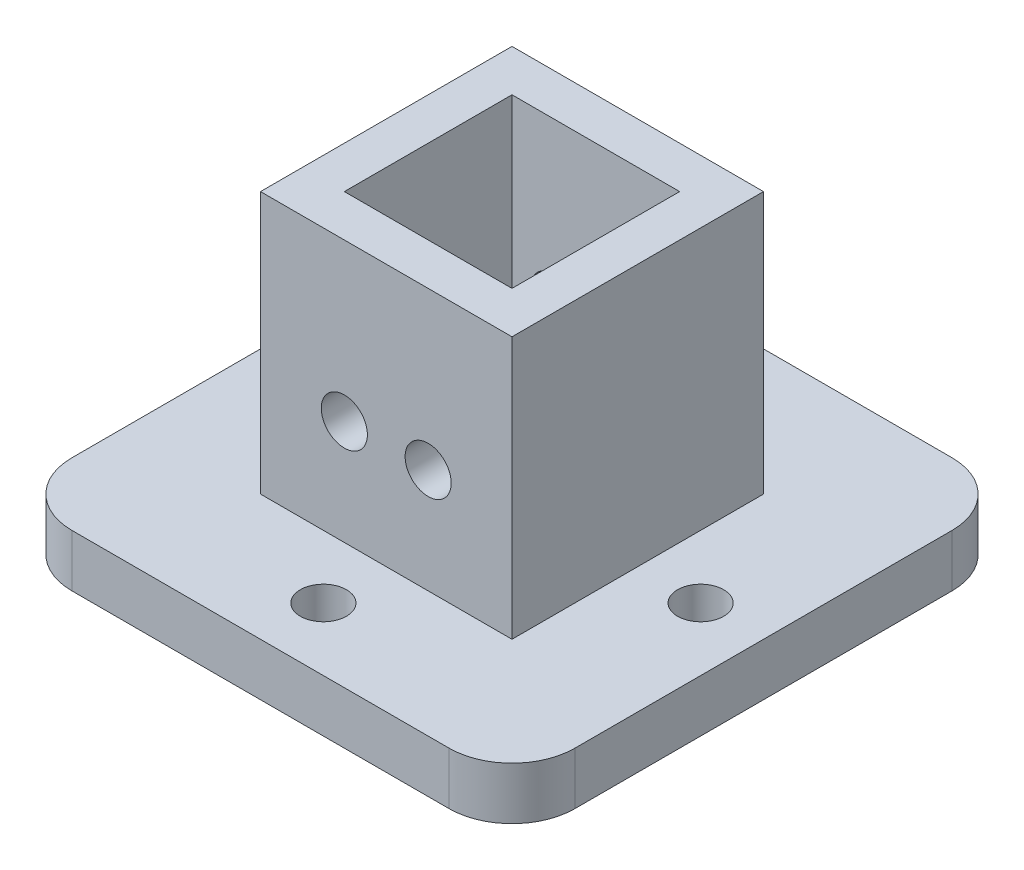
ISO-10303-21;
HEADER;
FILE_DESCRIPTION(('STEP AP214'),'2;1');
FILE_NAME('part.step','',(''),(''),'','','');
FILE_SCHEMA(('AUTOMOTIVE_DESIGN { 1 0 10303 214 1 1 1 1 }'));
ENDSEC;
DATA;
#1=APPLICATION_CONTEXT('core data for automotive mechanical design processes');
#2=APPLICATION_PROTOCOL_DEFINITION('international standard','automotive_design',2000,#1);
#3=PRODUCT_CONTEXT('',#1,'mechanical');
#4=PRODUCT('Part','Part','',(#3));
#5=PRODUCT_RELATED_PRODUCT_CATEGORY('part','',(#4));
#6=PRODUCT_DEFINITION_FORMATION('','',#4);
#7=PRODUCT_DEFINITION_CONTEXT('part definition',#1,'design');
#8=PRODUCT_DEFINITION('design','',#6,#7);
#9=PRODUCT_DEFINITION_SHAPE('','',#8);
#10=(LENGTH_UNIT() NAMED_UNIT(*) SI_UNIT(.MILLI.,.METRE.));
#11=(NAMED_UNIT(*) PLANE_ANGLE_UNIT() SI_UNIT($,.RADIAN.));
#12=(NAMED_UNIT(*) SI_UNIT($,.STERADIAN.) SOLID_ANGLE_UNIT());
#13=UNCERTAINTY_MEASURE_WITH_UNIT(LENGTH_MEASURE(1.E-05),#10,'distance_accuracy_value','');
#14=(GEOMETRIC_REPRESENTATION_CONTEXT(3) GLOBAL_UNCERTAINTY_ASSIGNED_CONTEXT((#13)) GLOBAL_UNIT_ASSIGNED_CONTEXT((#10,
#11,#12)) REPRESENTATION_CONTEXT('',''));
#15=CARTESIAN_POINT('',(0.,0.,0.));
#16=DIRECTION('',(0.,0.,1.));
#17=DIRECTION('',(1.,0.,0.));
#18=AXIS2_PLACEMENT_3D('',#15,#16,#17);
#19=CARTESIAN_POINT('',(0.,30.,0.));
#20=DIRECTION('',(0.,0.,-1.));
#21=DIRECTION('',(-1.,0.,0.));
#22=AXIS2_PLACEMENT_3D('',#19,#20,#21);
#23=PLANE('',#22);
#24=CARTESIAN_POINT('',(16.,15.,0.));
#25=DIRECTION('',(0.,0.,1.));
#26=DIRECTION('',(-1.,0.,0.));
#27=AXIS2_PLACEMENT_3D('',#24,#25,#26);
#28=CIRCLE('',#27,2.2);
#29=CARTESIAN_POINT('',(13.8,15.,0.));
#30=VERTEX_POINT('',#29);
#31=EDGE_CURVE('E276',#30,#30,#28,.T.);
#32=ORIENTED_EDGE('',*,*,#31,.F.);
#33=EDGE_LOOP('',(#32));
#34=FACE_BOUND('',#33,.T.);
#35=CARTESIAN_POINT('',(8.,15.,0.));
#36=DIRECTION('',(0.,0.,1.));
#37=DIRECTION('',(1.,0.,0.));
#38=AXIS2_PLACEMENT_3D('',#35,#36,#37);
#39=CIRCLE('',#38,2.2);
#40=CARTESIAN_POINT('',(10.2,15.,0.));
#41=VERTEX_POINT('',#40);
#42=EDGE_CURVE('E196',#41,#41,#39,.T.);
#43=ORIENTED_EDGE('',*,*,#42,.F.);
#44=EDGE_LOOP('',(#43));
#45=FACE_BOUND('',#44,.T.);
#46=DIRECTION('',(-1.,0.,0.));
#47=VECTOR('',#46,1.);
#48=CARTESIAN_POINT('',(0.,5.,0.));
#49=LINE('',#48,#47);
#50=CARTESIAN_POINT('',(24.,5.,0.));
#51=VERTEX_POINT('',#50);
#52=CARTESIAN_POINT('',(0.,5.,0.));
#53=VERTEX_POINT('',#52);
#54=EDGE_CURVE('E157',#51,#53,#49,.T.);
#55=ORIENTED_EDGE('',*,*,#54,.F.);
#56=DIRECTION('',(0.,-1.,0.));
#57=VECTOR('',#56,1.);
#58=CARTESIAN_POINT('',(24.,30.,0.));
#59=LINE('',#58,#57);
#60=CARTESIAN_POINT('',(24.,30.,0.));
#61=VERTEX_POINT('',#60);
#62=EDGE_CURVE('E171',#61,#51,#59,.T.);
#63=ORIENTED_EDGE('',*,*,#62,.F.);
#64=DIRECTION('',(1.,0.,0.));
#65=VECTOR('',#64,1.);
#66=CARTESIAN_POINT('',(0.,30.,0.));
#67=LINE('',#66,#65);
#68=CARTESIAN_POINT('',(0.,30.,0.));
#69=VERTEX_POINT('',#68);
#70=EDGE_CURVE('E295',#69,#61,#67,.T.);
#71=ORIENTED_EDGE('',*,*,#70,.F.);
#72=DIRECTION('',(0.,-1.,0.));
#73=VECTOR('',#72,1.);
#74=CARTESIAN_POINT('',(0.,30.,0.));
#75=LINE('',#74,#73);
#76=EDGE_CURVE('E172',#69,#53,#75,.T.);
#77=ORIENTED_EDGE('',*,*,#76,.T.);
#78=EDGE_LOOP('',(#55,#63,#71,#77));
#79=FACE_BOUND('',#78,.T.);
#80=ADVANCED_FACE('F41',(#34,#45,#79),#23,.F.);
#81=CARTESIAN_POINT('',(24.,30.,0.));
#82=DIRECTION('',(-1.,0.,0.));
#83=DIRECTION('',(0.,0.,1.));
#84=AXIS2_PLACEMENT_3D('',#81,#82,#83);
#85=PLANE('',#84);
#86=DIRECTION('',(0.,0.,1.));
#87=VECTOR('',#86,1.);
#88=CARTESIAN_POINT('',(24.,5.,0.));
#89=LINE('',#88,#87);
#90=CARTESIAN_POINT('',(24.,5.,-24.));
#91=VERTEX_POINT('',#90);
#92=EDGE_CURVE('E154',#91,#51,#89,.T.);
#93=ORIENTED_EDGE('',*,*,#92,.F.);
#94=DIRECTION('',(0.,-1.,0.));
#95=VECTOR('',#94,1.);
#96=CARTESIAN_POINT('',(24.,30.,-24.));
#97=LINE('',#96,#95);
#98=CARTESIAN_POINT('',(24.,30.,-24.));
#99=VERTEX_POINT('',#98);
#100=EDGE_CURVE('E181',#99,#91,#97,.T.);
#101=ORIENTED_EDGE('',*,*,#100,.F.);
#102=DIRECTION('',(0.,0.,-1.));
#103=VECTOR('',#102,1.);
#104=CARTESIAN_POINT('',(24.,30.,0.));
#105=LINE('',#104,#103);
#106=EDGE_CURVE('E177',#61,#99,#105,.T.);
#107=ORIENTED_EDGE('',*,*,#106,.F.);
#108=ORIENTED_EDGE('',*,*,#62,.T.);
#109=EDGE_LOOP('',(#93,#101,#107,#108));
#110=FACE_BOUND('',#109,.T.);
#111=ADVANCED_FACE('F176',(#110),#85,.F.);
#112=CARTESIAN_POINT('',(0.,30.,-24.));
#113=DIRECTION('',(0.,0.,-1.));
#114=DIRECTION('',(-1.,0.,0.));
#115=AXIS2_PLACEMENT_3D('',#112,#113,#114);
#116=PLANE('',#115);
#117=CARTESIAN_POINT('',(8.,15.,-24.));
#118=DIRECTION('',(0.,0.,-1.));
#119=DIRECTION('',(-1.,0.,0.));
#120=AXIS2_PLACEMENT_3D('',#117,#118,#119);
#121=CIRCLE('',#120,2.2);
#122=CARTESIAN_POINT('',(5.8,15.,-24.));
#123=VERTEX_POINT('',#122);
#124=EDGE_CURVE('E201',#123,#123,#121,.T.);
#125=ORIENTED_EDGE('',*,*,#124,.F.);
#126=EDGE_LOOP('',(#125));
#127=FACE_BOUND('',#126,.T.);
#128=CARTESIAN_POINT('',(16.,15.,-24.));
#129=DIRECTION('',(0.,0.,-1.));
#130=DIRECTION('',(-1.,0.,0.));
#131=AXIS2_PLACEMENT_3D('',#128,#129,#130);
#132=CIRCLE('',#131,2.2);
#133=CARTESIAN_POINT('',(13.8,15.,-24.));
#134=VERTEX_POINT('',#133);
#135=EDGE_CURVE('E195',#134,#134,#132,.T.);
#136=ORIENTED_EDGE('',*,*,#135,.F.);
#137=EDGE_LOOP('',(#136));
#138=FACE_BOUND('',#137,.T.);
#139=ORIENTED_EDGE('',*,*,#100,.T.);
#140=DIRECTION('',(1.,0.,0.));
#141=VECTOR('',#140,1.);
#142=CARTESIAN_POINT('',(0.,5.,-24.));
#143=LINE('',#142,#141);
#144=CARTESIAN_POINT('',(0.,5.,-24.));
#145=VERTEX_POINT('',#144);
#146=EDGE_CURVE('E160',#145,#91,#143,.T.);
#147=ORIENTED_EDGE('',*,*,#146,.F.);
#148=DIRECTION('',(0.,-1.,0.));
#149=VECTOR('',#148,1.);
#150=CARTESIAN_POINT('',(0.,30.,-24.));
#151=LINE('',#150,#149);
#152=CARTESIAN_POINT('',(0.,30.,-24.));
#153=VERTEX_POINT('',#152);
#154=EDGE_CURVE('E187',#153,#145,#151,.T.);
#155=ORIENTED_EDGE('',*,*,#154,.F.);
#156=DIRECTION('',(1.,0.,0.));
#157=VECTOR('',#156,1.);
#158=CARTESIAN_POINT('',(0.,30.,-24.));
#159=LINE('',#158,#157);
#160=EDGE_CURVE('E301',#153,#99,#159,.T.);
#161=ORIENTED_EDGE('',*,*,#160,.T.);
#162=EDGE_LOOP('',(#139,#147,#155,#161));
#163=FACE_BOUND('',#162,.T.);
#164=ADVANCED_FACE('F352',(#127,#138,#163),#116,.T.);
#165=CARTESIAN_POINT('',(0.,30.,0.));
#166=DIRECTION('',(-1.,0.,0.));
#167=DIRECTION('',(0.,0.,1.));
#168=AXIS2_PLACEMENT_3D('',#165,#166,#167);
#169=PLANE('',#168);
#170=ORIENTED_EDGE('',*,*,#154,.T.);
#171=DIRECTION('',(0.,0.,-1.));
#172=VECTOR('',#171,1.);
#173=CARTESIAN_POINT('',(0.,5.,0.));
#174=LINE('',#173,#172);
#175=EDGE_CURVE('E280',#53,#145,#174,.T.);
#176=ORIENTED_EDGE('',*,*,#175,.F.);
#177=ORIENTED_EDGE('',*,*,#76,.F.);
#178=DIRECTION('',(0.,0.,-1.));
#179=VECTOR('',#178,1.);
#180=CARTESIAN_POINT('',(0.,30.,0.));
#181=LINE('',#180,#179);
#182=EDGE_CURVE('E305',#69,#153,#181,.T.);
#183=ORIENTED_EDGE('',*,*,#182,.T.);
#184=EDGE_LOOP('',(#170,#176,#177,#183));
#185=FACE_BOUND('',#184,.T.);
#186=ADVANCED_FACE('F348',(#185),#169,.T.);
#187=CARTESIAN_POINT('',(20.,30.,0.));
#188=DIRECTION('',(-1.,0.,0.));
#189=DIRECTION('',(0.,0.,1.));
#190=AXIS2_PLACEMENT_3D('',#187,#188,#189);
#191=PLANE('',#190);
#192=DIRECTION('',(0.,0.,-1.));
#193=VECTOR('',#192,1.);
#194=CARTESIAN_POINT('',(20.,0.,0.));
#195=LINE('',#194,#193);
#196=CARTESIAN_POINT('',(20.,0.,-4.));
#197=VERTEX_POINT('',#196);
#198=CARTESIAN_POINT('',(20.,0.,-20.));
#199=VERTEX_POINT('',#198);
#200=EDGE_CURVE('E294',#197,#199,#195,.T.);
#201=ORIENTED_EDGE('',*,*,#200,.F.);
#202=DIRECTION('',(0.,-1.,0.));
#203=VECTOR('',#202,1.);
#204=CARTESIAN_POINT('',(20.,30.,-4.));
#205=LINE('',#204,#203);
#206=CARTESIAN_POINT('',(20.,30.,-4.));
#207=VERTEX_POINT('',#206);
#208=EDGE_CURVE('E207',#207,#197,#205,.T.);
#209=ORIENTED_EDGE('',*,*,#208,.F.);
#210=DIRECTION('',(0.,0.,-1.));
#211=VECTOR('',#210,1.);
#212=CARTESIAN_POINT('',(20.,30.,0.));
#213=LINE('',#212,#211);
#214=CARTESIAN_POINT('',(20.,30.,-20.));
#215=VERTEX_POINT('',#214);
#216=EDGE_CURVE('E309',#207,#215,#213,.T.);
#217=ORIENTED_EDGE('',*,*,#216,.T.);
#218=DIRECTION('',(0.,-1.,0.));
#219=VECTOR('',#218,1.);
#220=CARTESIAN_POINT('',(20.,30.,-20.));
#221=LINE('',#220,#219);
#222=EDGE_CURVE('E180',#215,#199,#221,.T.);
#223=ORIENTED_EDGE('',*,*,#222,.T.);
#224=EDGE_LOOP('',(#201,#209,#217,#223));
#225=FACE_BOUND('',#224,.T.);
#226=ADVANCED_FACE('F367',(#225),#191,.T.);
#227=CARTESIAN_POINT('',(0.,30.,-3.99999999999999));
#228=DIRECTION('',(0.,0.,1.));
#229=DIRECTION('',(1.,0.,0.));
#230=AXIS2_PLACEMENT_3D('',#227,#228,#229);
#231=PLANE('',#230);
#232=CARTESIAN_POINT('',(8.,15.,-3.99999999999999));
#233=DIRECTION('',(0.,0.,1.));
#234=DIRECTION('',(1.,0.,0.));
#235=AXIS2_PLACEMENT_3D('',#232,#233,#234);
#236=CIRCLE('',#235,2.2);
#237=CARTESIAN_POINT('',(10.2,15.,-3.99999999999999));
#238=VERTEX_POINT('',#237);
#239=EDGE_CURVE('E290',#238,#238,#236,.T.);
#240=ORIENTED_EDGE('',*,*,#239,.T.);
#241=EDGE_LOOP('',(#240));
#242=FACE_BOUND('',#241,.T.);
#243=CARTESIAN_POINT('',(16.,15.,-4.));
#244=DIRECTION('',(0.,0.,1.));
#245=DIRECTION('',(1.,0.,0.));
#246=AXIS2_PLACEMENT_3D('',#243,#244,#245);
#247=CIRCLE('',#246,2.2);
#248=CARTESIAN_POINT('',(18.2,15.,-4.));
#249=VERTEX_POINT('',#248);
#250=EDGE_CURVE('E202',#249,#249,#247,.T.);
#251=ORIENTED_EDGE('',*,*,#250,.T.);
#252=EDGE_LOOP('',(#251));
#253=FACE_BOUND('',#252,.T.);
#254=DIRECTION('',(-1.,0.,0.));
#255=VECTOR('',#254,1.);
#256=CARTESIAN_POINT('',(0.,0.,-3.99999999999999));
#257=LINE('',#256,#255);
#258=CARTESIAN_POINT('',(4.00000000000001,0.,-3.99999999999999));
#259=VERTEX_POINT('',#258);
#260=EDGE_CURVE('E326',#197,#259,#257,.T.);
#261=ORIENTED_EDGE('',*,*,#260,.T.);
#262=DIRECTION('',(0.,-1.,0.));
#263=VECTOR('',#262,1.);
#264=CARTESIAN_POINT('',(4.00000000000001,30.,-3.99999999999999));
#265=LINE('',#264,#263);
#266=CARTESIAN_POINT('',(4.00000000000001,30.,-3.99999999999999));
#267=VERTEX_POINT('',#266);
#268=EDGE_CURVE('E339',#267,#259,#265,.T.);
#269=ORIENTED_EDGE('',*,*,#268,.F.);
#270=DIRECTION('',(-1.,0.,0.));
#271=VECTOR('',#270,1.);
#272=CARTESIAN_POINT('',(0.,30.,-3.99999999999999));
#273=LINE('',#272,#271);
#274=EDGE_CURVE('E313',#207,#267,#273,.T.);
#275=ORIENTED_EDGE('',*,*,#274,.F.);
#276=ORIENTED_EDGE('',*,*,#208,.T.);
#277=EDGE_LOOP('',(#261,#269,#275,#276));
#278=FACE_BOUND('',#277,.T.);
#279=ADVANCED_FACE('F370',(#242,#253,#278),#231,.F.);
#280=CARTESIAN_POINT('',(4.00000000000001,30.,0.));
#281=DIRECTION('',(1.,0.,0.));
#282=DIRECTION('',(0.,0.,-1.));
#283=AXIS2_PLACEMENT_3D('',#280,#281,#282);
#284=PLANE('',#283);
#285=DIRECTION('',(0.,0.,1.));
#286=VECTOR('',#285,1.);
#287=CARTESIAN_POINT('',(4.00000000000001,0.,0.));
#288=LINE('',#287,#286);
#289=CARTESIAN_POINT('',(4.,0.,-20.));
#290=VERTEX_POINT('',#289);
#291=EDGE_CURVE('E330',#290,#259,#288,.T.);
#292=ORIENTED_EDGE('',*,*,#291,.F.);
#293=DIRECTION('',(0.,-1.,0.));
#294=VECTOR('',#293,1.);
#295=CARTESIAN_POINT('',(4.,30.,-20.));
#296=LINE('',#295,#294);
#297=CARTESIAN_POINT('',(4.,30.,-20.));
#298=VERTEX_POINT('',#297);
#299=EDGE_CURVE('E185',#298,#290,#296,.T.);
#300=ORIENTED_EDGE('',*,*,#299,.F.);
#301=DIRECTION('',(0.,0.,1.));
#302=VECTOR('',#301,1.);
#303=CARTESIAN_POINT('',(4.00000000000001,30.,0.));
#304=LINE('',#303,#302);
#305=EDGE_CURVE('E316',#298,#267,#304,.T.);
#306=ORIENTED_EDGE('',*,*,#305,.T.);
#307=ORIENTED_EDGE('',*,*,#268,.T.);
#308=EDGE_LOOP('',(#292,#300,#306,#307));
#309=FACE_BOUND('',#308,.T.);
#310=ADVANCED_FACE('F373',(#309),#284,.T.);
#311=CARTESIAN_POINT('',(0.,30.,-20.));
#312=DIRECTION('',(0.,0.,-1.));
#313=DIRECTION('',(-1.,0.,0.));
#314=AXIS2_PLACEMENT_3D('',#311,#312,#313);
#315=PLANE('',#314);
#316=CARTESIAN_POINT('',(8.,15.,-20.));
#317=DIRECTION('',(0.,0.,-1.));
#318=DIRECTION('',(-1.,0.,0.));
#319=AXIS2_PLACEMENT_3D('',#316,#317,#318);
#320=CIRCLE('',#319,2.2);
#321=CARTESIAN_POINT('',(5.8,15.,-20.));
#322=VERTEX_POINT('',#321);
#323=EDGE_CURVE('E197',#322,#322,#320,.T.);
#324=ORIENTED_EDGE('',*,*,#323,.T.);
#325=EDGE_LOOP('',(#324));
#326=FACE_BOUND('',#325,.T.);
#327=CARTESIAN_POINT('',(16.,15.,-20.));
#328=DIRECTION('',(0.,0.,-1.));
#329=DIRECTION('',(-1.,0.,0.));
#330=AXIS2_PLACEMENT_3D('',#327,#328,#329);
#331=CIRCLE('',#330,2.2);
#332=CARTESIAN_POINT('',(13.8,15.,-20.));
#333=VERTEX_POINT('',#332);
#334=EDGE_CURVE('E191',#333,#333,#331,.T.);
#335=ORIENTED_EDGE('',*,*,#334,.T.);
#336=EDGE_LOOP('',(#335));
#337=FACE_BOUND('',#336,.T.);
#338=DIRECTION('',(1.,0.,0.));
#339=VECTOR('',#338,1.);
#340=CARTESIAN_POINT('',(0.,0.,-20.));
#341=LINE('',#340,#339);
#342=EDGE_CURVE('E298',#290,#199,#341,.T.);
#343=ORIENTED_EDGE('',*,*,#342,.T.);
#344=ORIENTED_EDGE('',*,*,#222,.F.);
#345=DIRECTION('',(1.,0.,0.));
#346=VECTOR('',#345,1.);
#347=CARTESIAN_POINT('',(0.,30.,-20.));
#348=LINE('',#347,#346);
#349=EDGE_CURVE('E320',#298,#215,#348,.T.);
#350=ORIENTED_EDGE('',*,*,#349,.F.);
#351=ORIENTED_EDGE('',*,*,#299,.T.);
#352=EDGE_LOOP('',(#343,#344,#350,#351));
#353=FACE_BOUND('',#352,.T.);
#354=ADVANCED_FACE('F357',(#326,#337,#353),#315,.F.);
#355=CARTESIAN_POINT('',(0.,30.,0.));
#356=DIRECTION('',(0.,1.,0.));
#357=DIRECTION('',(0.,0.,1.));
#358=AXIS2_PLACEMENT_3D('',#355,#356,#357);
#359=PLANE('',#358);
#360=ORIENTED_EDGE('',*,*,#70,.T.);
#361=ORIENTED_EDGE('',*,*,#106,.T.);
#362=ORIENTED_EDGE('',*,*,#160,.F.);
#363=ORIENTED_EDGE('',*,*,#182,.F.);
#364=EDGE_LOOP('',(#360,#361,#362,#363));
#365=FACE_BOUND('',#364,.T.);
#366=ORIENTED_EDGE('',*,*,#216,.F.);
#367=ORIENTED_EDGE('',*,*,#274,.T.);
#368=ORIENTED_EDGE('',*,*,#305,.F.);
#369=ORIENTED_EDGE('',*,*,#349,.T.);
#370=EDGE_LOOP('',(#366,#367,#368,#369));
#371=FACE_BOUND('',#370,.T.);
#372=ADVANCED_FACE('F354',(#365,#371),#359,.T.);
#373=CARTESIAN_POINT('',(0.,0.,0.));
#374=DIRECTION('',(0.,1.,0.));
#375=DIRECTION('',(0.,0.,1.));
#376=AXIS2_PLACEMENT_3D('',#373,#374,#375);
#377=PLANE('',#376);
#378=CARTESIAN_POINT('',(12.,0.,6.));
#379=DIRECTION('',(0.,1.,0.));
#380=DIRECTION('',(0.,0.,1.));
#381=AXIS2_PLACEMENT_3D('',#378,#379,#380);
#382=CIRCLE('',#381,2.2);
#383=CARTESIAN_POINT('',(12.,0.,8.2));
#384=VERTEX_POINT('',#383);
#385=EDGE_CURVE('E442',#384,#384,#382,.T.);
#386=ORIENTED_EDGE('',*,*,#385,.T.);
#387=EDGE_LOOP('',(#386));
#388=FACE_BOUND('',#387,.T.);
#389=CARTESIAN_POINT('',(-6.,0.,-12.0000000000001));
#390=DIRECTION('',(0.,1.,0.));
#391=DIRECTION('',(0.,0.,1.));
#392=AXIS2_PLACEMENT_3D('',#389,#390,#391);
#393=CIRCLE('',#392,2.2);
#394=CARTESIAN_POINT('',(-6.,0.,-9.80000000000006));
#395=VERTEX_POINT('',#394);
#396=EDGE_CURVE('E690',#395,#395,#393,.T.);
#397=ORIENTED_EDGE('',*,*,#396,.T.);
#398=EDGE_LOOP('',(#397));
#399=FACE_BOUND('',#398,.T.);
#400=CARTESIAN_POINT('',(12.0000000000001,0.,-30.));
#401=DIRECTION('',(0.,1.,0.));
#402=DIRECTION('',(0.,0.,1.));
#403=AXIS2_PLACEMENT_3D('',#400,#401,#402);
#404=CIRCLE('',#403,2.2);
#405=CARTESIAN_POINT('',(12.0000000000001,0.,-27.8));
#406=VERTEX_POINT('',#405);
#407=EDGE_CURVE('E702',#406,#406,#404,.T.);
#408=ORIENTED_EDGE('',*,*,#407,.T.);
#409=EDGE_LOOP('',(#408));
#410=FACE_BOUND('',#409,.T.);
#411=CARTESIAN_POINT('',(30.,0.,-11.9999999999998));
#412=DIRECTION('',(0.,1.,0.));
#413=DIRECTION('',(0.,0.,1.));
#414=AXIS2_PLACEMENT_3D('',#411,#412,#413);
#415=CIRCLE('',#414,2.2);
#416=CARTESIAN_POINT('',(30.,0.,-9.79999999999981));
#417=VERTEX_POINT('',#416);
#418=EDGE_CURVE('E710',#417,#417,#415,.T.);
#419=ORIENTED_EDGE('',*,*,#418,.T.);
#420=EDGE_LOOP('',(#419));
#421=FACE_BOUND('',#420,.T.);
#422=ORIENTED_EDGE('',*,*,#200,.T.);
#423=ORIENTED_EDGE('',*,*,#342,.F.);
#424=ORIENTED_EDGE('',*,*,#291,.T.);
#425=ORIENTED_EDGE('',*,*,#260,.F.);
#426=EDGE_LOOP('',(#422,#423,#424,#425));
#427=FACE_BOUND('',#426,.T.);
#428=DIRECTION('',(1.,0.,0.));
#429=VECTOR('',#428,1.);
#430=CARTESIAN_POINT('',(0.,0.,12.));
#431=LINE('',#430,#429);
#432=CARTESIAN_POINT('',(-6.00000000000001,0.,12.));
#433=VERTEX_POINT('',#432);
#434=CARTESIAN_POINT('',(30.,0.,12.));
#435=VERTEX_POINT('',#434);
#436=EDGE_CURVE('E269',#433,#435,#431,.T.);
#437=ORIENTED_EDGE('',*,*,#436,.F.);
#438=CARTESIAN_POINT('',(-6.00000000000001,0.,6.));
#439=DIRECTION('',(0.,1.,0.));
#440=DIRECTION('',(0.,0.,1.));
#441=AXIS2_PLACEMENT_3D('',#438,#439,#440);
#442=CIRCLE('',#441,6.);
#443=CARTESIAN_POINT('',(-12.,0.,6.));
#444=VERTEX_POINT('',#443);
#445=EDGE_CURVE('E220',#433,#444,#442,.F.);
#446=ORIENTED_EDGE('',*,*,#445,.T.);
#447=DIRECTION('',(0.,0.,-1.));
#448=VECTOR('',#447,1.);
#449=CARTESIAN_POINT('',(-12.,0.,0.));
#450=LINE('',#449,#448);
#451=CARTESIAN_POINT('',(-12.,0.,-30.));
#452=VERTEX_POINT('',#451);
#453=EDGE_CURVE('E262',#444,#452,#450,.T.);
#454=ORIENTED_EDGE('',*,*,#453,.T.);
#455=CARTESIAN_POINT('',(-5.99999999999999,0.,-30.));
#456=DIRECTION('',(0.,1.,0.));
#457=DIRECTION('',(0.,0.,1.));
#458=AXIS2_PLACEMENT_3D('',#455,#456,#457);
#459=CIRCLE('',#458,6.);
#460=CARTESIAN_POINT('',(-5.99999999999999,0.,-36.));
#461=VERTEX_POINT('',#460);
#462=EDGE_CURVE('E214',#452,#461,#459,.F.);
#463=ORIENTED_EDGE('',*,*,#462,.T.);
#464=DIRECTION('',(-1.,0.,0.));
#465=VECTOR('',#464,1.);
#466=CARTESIAN_POINT('',(0.,0.,-36.));
#467=LINE('',#466,#465);
#468=CARTESIAN_POINT('',(30.,0.,-36.));
#469=VERTEX_POINT('',#468);
#470=EDGE_CURVE('E252',#469,#461,#467,.T.);
#471=ORIENTED_EDGE('',*,*,#470,.F.);
#472=CARTESIAN_POINT('',(30.,0.,-30.));
#473=DIRECTION('',(0.,1.,0.));
#474=DIRECTION('',(0.,0.,1.));
#475=AXIS2_PLACEMENT_3D('',#472,#473,#474);
#476=CIRCLE('',#475,6.);
#477=CARTESIAN_POINT('',(36.,0.,-30.));
#478=VERTEX_POINT('',#477);
#479=EDGE_CURVE('E211',#469,#478,#476,.F.);
#480=ORIENTED_EDGE('',*,*,#479,.T.);
#481=DIRECTION('',(0.,0.,1.));
#482=VECTOR('',#481,1.);
#483=CARTESIAN_POINT('',(36.,0.,0.));
#484=LINE('',#483,#482);
#485=CARTESIAN_POINT('',(36.,0.,6.));
#486=VERTEX_POINT('',#485);
#487=EDGE_CURVE('E440',#478,#486,#484,.T.);
#488=ORIENTED_EDGE('',*,*,#487,.T.);
#489=CARTESIAN_POINT('',(30.,0.,6.));
#490=DIRECTION('',(0.,1.,0.));
#491=DIRECTION('',(0.,0.,1.));
#492=AXIS2_PLACEMENT_3D('',#489,#490,#491);
#493=CIRCLE('',#492,6.);
#494=EDGE_CURVE('E217',#486,#435,#493,.F.);
#495=ORIENTED_EDGE('',*,*,#494,.T.);
#496=EDGE_LOOP('',(#437,#446,#454,#463,#471,#480,#488,#495));
#497=FACE_BOUND('',#496,.T.);
#498=ADVANCED_FACE('F256',(#388,#399,#410,#421,#427,#497),#377,.F.);
#499=CARTESIAN_POINT('',(16.,15.,-31.));
#500=DIRECTION('',(0.,0.,1.));
#501=DIRECTION('',(1.,0.,0.));
#502=AXIS2_PLACEMENT_3D('',#499,#500,#501);
#503=CYLINDRICAL_SURFACE('',#502,2.2);
#504=ORIENTED_EDGE('',*,*,#135,.T.);
#505=EDGE_LOOP('',(#504));
#506=FACE_BOUND('',#505,.T.);
#507=ORIENTED_EDGE('',*,*,#334,.F.);
#508=EDGE_LOOP('',(#507));
#509=FACE_BOUND('',#508,.T.);
#510=ADVANCED_FACE('F378',(#506,#509),#503,.F.);
#511=CARTESIAN_POINT('',(8.,15.,-31.));
#512=DIRECTION('',(0.,0.,1.));
#513=DIRECTION('',(1.,0.,0.));
#514=AXIS2_PLACEMENT_3D('',#511,#512,#513);
#515=CYLINDRICAL_SURFACE('',#514,2.2);
#516=ORIENTED_EDGE('',*,*,#124,.T.);
#517=EDGE_LOOP('',(#516));
#518=FACE_BOUND('',#517,.T.);
#519=ORIENTED_EDGE('',*,*,#323,.F.);
#520=EDGE_LOOP('',(#519));
#521=FACE_BOUND('',#520,.T.);
#522=ADVANCED_FACE('F385',(#518,#521),#515,.F.);
#523=ORIENTED_EDGE('',*,*,#31,.T.);
#524=EDGE_LOOP('',(#523));
#525=FACE_BOUND('',#524,.T.);
#526=ORIENTED_EDGE('',*,*,#250,.F.);
#527=EDGE_LOOP('',(#526));
#528=FACE_BOUND('',#527,.T.);
#529=ADVANCED_FACE('F388',(#525,#528),#503,.F.);
#530=ORIENTED_EDGE('',*,*,#42,.T.);
#531=EDGE_LOOP('',(#530));
#532=FACE_BOUND('',#531,.T.);
#533=ORIENTED_EDGE('',*,*,#239,.F.);
#534=EDGE_LOOP('',(#533));
#535=FACE_BOUND('',#534,.T.);
#536=ADVANCED_FACE('F456',(#532,#535),#515,.F.);
#537=CARTESIAN_POINT('',(36.,5.,0.));
#538=DIRECTION('',(1.,0.,0.));
#539=DIRECTION('',(0.,0.,-1.));
#540=AXIS2_PLACEMENT_3D('',#537,#538,#539);
#541=PLANE('',#540);
#542=DIRECTION('',(0.,0.,1.));
#543=VECTOR('',#542,1.);
#544=CARTESIAN_POINT('',(36.,5.,0.));
#545=LINE('',#544,#543);
#546=CARTESIAN_POINT('',(36.,5.,-30.));
#547=VERTEX_POINT('',#546);
#548=CARTESIAN_POINT('',(36.,5.,6.));
#549=VERTEX_POINT('',#548);
#550=EDGE_CURVE('E261',#547,#549,#545,.T.);
#551=ORIENTED_EDGE('',*,*,#550,.T.);
#552=DIRECTION('',(0.,-1.,0.));
#553=VECTOR('',#552,1.);
#554=CARTESIAN_POINT('',(36.,0.,6.));
#555=LINE('',#554,#553);
#556=EDGE_CURVE('E244',#549,#486,#555,.T.);
#557=ORIENTED_EDGE('',*,*,#556,.T.);
#558=ORIENTED_EDGE('',*,*,#487,.F.);
#559=DIRECTION('',(0.,-1.,0.));
#560=VECTOR('',#559,1.);
#561=CARTESIAN_POINT('',(36.,5.,-30.));
#562=LINE('',#561,#560);
#563=EDGE_CURVE('E241',#478,#547,#562,.F.);
#564=ORIENTED_EDGE('',*,*,#563,.T.);
#565=EDGE_LOOP('',(#551,#557,#558,#564));
#566=FACE_BOUND('',#565,.T.);
#567=ADVANCED_FACE('F453',(#566),#541,.T.);
#568=CARTESIAN_POINT('',(0.,5.,-36.));
#569=DIRECTION('',(0.,0.,1.));
#570=DIRECTION('',(1.,0.,0.));
#571=AXIS2_PLACEMENT_3D('',#568,#569,#570);
#572=PLANE('',#571);
#573=ORIENTED_EDGE('',*,*,#470,.T.);
#574=DIRECTION('',(0.,-1.,0.));
#575=VECTOR('',#574,1.);
#576=CARTESIAN_POINT('',(-5.99999999999999,5.,-36.));
#577=LINE('',#576,#575);
#578=CARTESIAN_POINT('',(-5.99999999999999,5.,-36.));
#579=VERTEX_POINT('',#578);
#580=EDGE_CURVE('E11',#461,#579,#577,.F.);
#581=ORIENTED_EDGE('',*,*,#580,.T.);
#582=DIRECTION('',(-1.,0.,0.));
#583=VECTOR('',#582,1.);
#584=CARTESIAN_POINT('',(0.,5.,-36.));
#585=LINE('',#584,#583);
#586=CARTESIAN_POINT('',(30.,5.,-36.));
#587=VERTEX_POINT('',#586);
#588=EDGE_CURVE('E174',#587,#579,#585,.T.);
#589=ORIENTED_EDGE('',*,*,#588,.F.);
#590=DIRECTION('',(0.,-1.,0.));
#591=VECTOR('',#590,1.);
#592=CARTESIAN_POINT('',(30.,0.,-36.));
#593=LINE('',#592,#591);
#594=EDGE_CURVE('E50',#587,#469,#593,.T.);
#595=ORIENTED_EDGE('',*,*,#594,.T.);
#596=EDGE_LOOP('',(#573,#581,#589,#595));
#597=FACE_BOUND('',#596,.T.);
#598=ADVANCED_FACE('F251',(#597),#572,.F.);
#599=CARTESIAN_POINT('',(-12.,5.,0.));
#600=DIRECTION('',(-1.,0.,0.));
#601=DIRECTION('',(0.,0.,1.));
#602=AXIS2_PLACEMENT_3D('',#599,#600,#601);
#603=PLANE('',#602);
#604=ORIENTED_EDGE('',*,*,#453,.F.);
#605=DIRECTION('',(0.,-1.,0.));
#606=VECTOR('',#605,1.);
#607=CARTESIAN_POINT('',(-12.,5.,6.));
#608=LINE('',#607,#606);
#609=CARTESIAN_POINT('',(-12.,5.,6.));
#610=VERTEX_POINT('',#609);
#611=EDGE_CURVE('E227',#444,#610,#608,.F.);
#612=ORIENTED_EDGE('',*,*,#611,.T.);
#613=DIRECTION('',(0.,0.,-1.));
#614=VECTOR('',#613,1.);
#615=CARTESIAN_POINT('',(-12.,5.,0.));
#616=LINE('',#615,#614);
#617=CARTESIAN_POINT('',(-12.,5.,-30.));
#618=VERTEX_POINT('',#617);
#619=EDGE_CURVE('E422',#610,#618,#616,.T.);
#620=ORIENTED_EDGE('',*,*,#619,.T.);
#621=DIRECTION('',(0.,-1.,0.));
#622=VECTOR('',#621,1.);
#623=CARTESIAN_POINT('',(-12.,0.,-30.));
#624=LINE('',#623,#622);
#625=EDGE_CURVE('E223',#618,#452,#624,.T.);
#626=ORIENTED_EDGE('',*,*,#625,.T.);
#627=EDGE_LOOP('',(#604,#612,#620,#626));
#628=FACE_BOUND('',#627,.T.);
#629=ADVANCED_FACE('F426',(#628),#603,.T.);
#630=CARTESIAN_POINT('',(0.,5.,12.));
#631=DIRECTION('',(0.,0.,-1.));
#632=DIRECTION('',(-1.,0.,0.));
#633=AXIS2_PLACEMENT_3D('',#630,#631,#632);
#634=PLANE('',#633);
#635=DIRECTION('',(1.,0.,0.));
#636=VECTOR('',#635,1.);
#637=CARTESIAN_POINT('',(0.,5.,12.));
#638=LINE('',#637,#636);
#639=CARTESIAN_POINT('',(-6.00000000000001,5.,12.));
#640=VERTEX_POINT('',#639);
#641=CARTESIAN_POINT('',(30.,5.,12.));
#642=VERTEX_POINT('',#641);
#643=EDGE_CURVE('E267',#640,#642,#638,.T.);
#644=ORIENTED_EDGE('',*,*,#643,.F.);
#645=DIRECTION('',(0.,-1.,0.));
#646=VECTOR('',#645,1.);
#647=CARTESIAN_POINT('',(-6.00000000000001,0.,12.));
#648=LINE('',#647,#646);
#649=EDGE_CURVE('E206',#640,#433,#648,.T.);
#650=ORIENTED_EDGE('',*,*,#649,.T.);
#651=ORIENTED_EDGE('',*,*,#436,.T.);
#652=DIRECTION('',(0.,-1.,0.));
#653=VECTOR('',#652,1.);
#654=CARTESIAN_POINT('',(30.,5.,12.));
#655=LINE('',#654,#653);
#656=EDGE_CURVE('E203',#435,#642,#655,.F.);
#657=ORIENTED_EDGE('',*,*,#656,.T.);
#658=EDGE_LOOP('',(#644,#650,#651,#657));
#659=FACE_BOUND('',#658,.T.);
#660=ADVANCED_FACE('F448',(#659),#634,.F.);
#661=CARTESIAN_POINT('',(0.,5.,0.));
#662=DIRECTION('',(0.,-1.,0.));
#663=DIRECTION('',(0.,0.,-1.));
#664=AXIS2_PLACEMENT_3D('',#661,#662,#663);
#665=PLANE('',#664);
#666=CARTESIAN_POINT('',(12.,5.,6.));
#667=DIRECTION('',(0.,1.,0.));
#668=DIRECTION('',(0.,0.,1.));
#669=AXIS2_PLACEMENT_3D('',#666,#667,#668);
#670=CIRCLE('',#669,2.2);
#671=CARTESIAN_POINT('',(12.,5.,8.2));
#672=VERTEX_POINT('',#671);
#673=EDGE_CURVE('E688',#672,#672,#670,.T.);
#674=ORIENTED_EDGE('',*,*,#673,.F.);
#675=EDGE_LOOP('',(#674));
#676=FACE_BOUND('',#675,.T.);
#677=CARTESIAN_POINT('',(-6.,5.,-12.0000000000001));
#678=DIRECTION('',(0.,1.,0.));
#679=DIRECTION('',(0.,0.,1.));
#680=AXIS2_PLACEMENT_3D('',#677,#678,#679);
#681=CIRCLE('',#680,2.2);
#682=CARTESIAN_POINT('',(-6.,5.,-9.80000000000006));
#683=VERTEX_POINT('',#682);
#684=EDGE_CURVE('E696',#683,#683,#681,.T.);
#685=ORIENTED_EDGE('',*,*,#684,.F.);
#686=EDGE_LOOP('',(#685));
#687=FACE_BOUND('',#686,.T.);
#688=CARTESIAN_POINT('',(12.0000000000001,5.,-30.));
#689=DIRECTION('',(0.,1.,0.));
#690=DIRECTION('',(0.,0.,1.));
#691=AXIS2_PLACEMENT_3D('',#688,#689,#690);
#692=CIRCLE('',#691,2.2);
#693=CARTESIAN_POINT('',(12.0000000000001,5.,-27.8));
#694=VERTEX_POINT('',#693);
#695=EDGE_CURVE('E706',#694,#694,#692,.T.);
#696=ORIENTED_EDGE('',*,*,#695,.F.);
#697=EDGE_LOOP('',(#696));
#698=FACE_BOUND('',#697,.T.);
#699=CARTESIAN_POINT('',(30.,5.,-11.9999999999998));
#700=DIRECTION('',(0.,1.,0.));
#701=DIRECTION('',(0.,0.,1.));
#702=AXIS2_PLACEMENT_3D('',#699,#700,#701);
#703=CIRCLE('',#702,2.2);
#704=CARTESIAN_POINT('',(30.,5.,-9.79999999999981));
#705=VERTEX_POINT('',#704);
#706=EDGE_CURVE('E714',#705,#705,#703,.T.);
#707=ORIENTED_EDGE('',*,*,#706,.F.);
#708=EDGE_LOOP('',(#707));
#709=FACE_BOUND('',#708,.T.);
#710=ORIENTED_EDGE('',*,*,#619,.F.);
#711=CARTESIAN_POINT('',(-6.00000000000001,5.,6.));
#712=DIRECTION('',(0.,-1.,0.));
#713=DIRECTION('',(0.,0.,-1.));
#714=AXIS2_PLACEMENT_3D('',#711,#712,#713);
#715=CIRCLE('',#714,6.);
#716=EDGE_CURVE('E238',#610,#640,#715,.F.);
#717=ORIENTED_EDGE('',*,*,#716,.T.);
#718=ORIENTED_EDGE('',*,*,#643,.T.);
#719=CARTESIAN_POINT('',(30.,5.,6.));
#720=DIRECTION('',(0.,-1.,0.));
#721=DIRECTION('',(0.,0.,-1.));
#722=AXIS2_PLACEMENT_3D('',#719,#720,#721);
#723=CIRCLE('',#722,6.);
#724=EDGE_CURVE('E235',#642,#549,#723,.F.);
#725=ORIENTED_EDGE('',*,*,#724,.T.);
#726=ORIENTED_EDGE('',*,*,#550,.F.);
#727=CARTESIAN_POINT('',(30.,5.,-30.));
#728=DIRECTION('',(0.,-1.,0.));
#729=DIRECTION('',(0.,0.,-1.));
#730=AXIS2_PLACEMENT_3D('',#727,#728,#729);
#731=CIRCLE('',#730,6.);
#732=EDGE_CURVE('E62',#547,#587,#731,.F.);
#733=ORIENTED_EDGE('',*,*,#732,.T.);
#734=ORIENTED_EDGE('',*,*,#588,.T.);
#735=CARTESIAN_POINT('',(-5.99999999999999,5.,-30.));
#736=DIRECTION('',(0.,-1.,0.));
#737=DIRECTION('',(0.,0.,-1.));
#738=AXIS2_PLACEMENT_3D('',#735,#736,#737);
#739=CIRCLE('',#738,6.);
#740=EDGE_CURVE('E232',#579,#618,#739,.F.);
#741=ORIENTED_EDGE('',*,*,#740,.T.);
#742=EDGE_LOOP('',(#710,#717,#718,#725,#726,#733,#734,#741));
#743=FACE_BOUND('',#742,.T.);
#744=ORIENTED_EDGE('',*,*,#54,.T.);
#745=ORIENTED_EDGE('',*,*,#175,.T.);
#746=ORIENTED_EDGE('',*,*,#146,.T.);
#747=ORIENTED_EDGE('',*,*,#92,.T.);
#748=EDGE_LOOP('',(#744,#745,#746,#747));
#749=FACE_BOUND('',#748,.T.);
#750=ADVANCED_FACE('F156',(#676,#687,#698,#709,#743,#749),#665,.F.);
#751=CARTESIAN_POINT('',(-6.00000000000001,5.,6.));
#752=DIRECTION('',(0.,1.,0.));
#753=DIRECTION('',(0.,0.,1.));
#754=AXIS2_PLACEMENT_3D('',#751,#752,#753);
#755=CYLINDRICAL_SURFACE('',#754,6.);
#756=ORIENTED_EDGE('',*,*,#716,.F.);
#757=ORIENTED_EDGE('',*,*,#611,.F.);
#758=ORIENTED_EDGE('',*,*,#445,.F.);
#759=ORIENTED_EDGE('',*,*,#649,.F.);
#760=EDGE_LOOP('',(#756,#757,#758,#759));
#761=FACE_BOUND('',#760,.T.);
#762=ADVANCED_FACE('F404',(#761),#755,.T.);
#763=CARTESIAN_POINT('',(30.,5.,6.));
#764=DIRECTION('',(0.,1.,0.));
#765=DIRECTION('',(0.,0.,1.));
#766=AXIS2_PLACEMENT_3D('',#763,#764,#765);
#767=CYLINDRICAL_SURFACE('',#766,6.);
#768=ORIENTED_EDGE('',*,*,#724,.F.);
#769=ORIENTED_EDGE('',*,*,#656,.F.);
#770=ORIENTED_EDGE('',*,*,#494,.F.);
#771=ORIENTED_EDGE('',*,*,#556,.F.);
#772=EDGE_LOOP('',(#768,#769,#770,#771));
#773=FACE_BOUND('',#772,.T.);
#774=ADVANCED_FACE('F407',(#773),#767,.T.);
#775=CARTESIAN_POINT('',(-5.99999999999999,5.,-30.));
#776=DIRECTION('',(0.,1.,0.));
#777=DIRECTION('',(0.,0.,1.));
#778=AXIS2_PLACEMENT_3D('',#775,#776,#777);
#779=CYLINDRICAL_SURFACE('',#778,6.);
#780=ORIENTED_EDGE('',*,*,#740,.F.);
#781=ORIENTED_EDGE('',*,*,#580,.F.);
#782=ORIENTED_EDGE('',*,*,#462,.F.);
#783=ORIENTED_EDGE('',*,*,#625,.F.);
#784=EDGE_LOOP('',(#780,#781,#782,#783));
#785=FACE_BOUND('',#784,.T.);
#786=ADVANCED_FACE('F410',(#785),#779,.T.);
#787=CARTESIAN_POINT('',(30.,5.,-30.));
#788=DIRECTION('',(0.,1.,0.));
#789=DIRECTION('',(0.,0.,1.));
#790=AXIS2_PLACEMENT_3D('',#787,#788,#789);
#791=CYLINDRICAL_SURFACE('',#790,6.);
#792=ORIENTED_EDGE('',*,*,#732,.F.);
#793=ORIENTED_EDGE('',*,*,#563,.F.);
#794=ORIENTED_EDGE('',*,*,#479,.F.);
#795=ORIENTED_EDGE('',*,*,#594,.F.);
#796=EDGE_LOOP('',(#792,#793,#794,#795));
#797=FACE_BOUND('',#796,.T.);
#798=ADVANCED_FACE('F43',(#797),#791,.T.);
#799=CARTESIAN_POINT('',(30.,0.,-11.9999999999998));
#800=DIRECTION('',(0.,1.,0.));
#801=DIRECTION('',(0.,0.,1.));
#802=AXIS2_PLACEMENT_3D('',#799,#800,#801);
#803=CYLINDRICAL_SURFACE('',#802,2.2);
#804=ORIENTED_EDGE('',*,*,#418,.F.);
#805=EDGE_LOOP('',(#804));
#806=FACE_BOUND('',#805,.T.);
#807=ORIENTED_EDGE('',*,*,#706,.T.);
#808=EDGE_LOOP('',(#807));
#809=FACE_BOUND('',#808,.T.);
#810=ADVANCED_FACE('F417',(#806,#809),#803,.F.);
#811=CARTESIAN_POINT('',(12.0000000000001,0.,-30.));
#812=DIRECTION('',(0.,1.,0.));
#813=DIRECTION('',(0.,0.,1.));
#814=AXIS2_PLACEMENT_3D('',#811,#812,#813);
#815=CYLINDRICAL_SURFACE('',#814,2.2);
#816=ORIENTED_EDGE('',*,*,#407,.F.);
#817=EDGE_LOOP('',(#816));
#818=FACE_BOUND('',#817,.T.);
#819=ORIENTED_EDGE('',*,*,#695,.T.);
#820=EDGE_LOOP('',(#819));
#821=FACE_BOUND('',#820,.T.);
#822=ADVANCED_FACE('F650',(#818,#821),#815,.F.);
#823=CARTESIAN_POINT('',(-6.,0.,-12.0000000000001));
#824=DIRECTION('',(0.,1.,0.));
#825=DIRECTION('',(0.,0.,1.));
#826=AXIS2_PLACEMENT_3D('',#823,#824,#825);
#827=CYLINDRICAL_SURFACE('',#826,2.2);
#828=ORIENTED_EDGE('',*,*,#396,.F.);
#829=EDGE_LOOP('',(#828));
#830=FACE_BOUND('',#829,.T.);
#831=ORIENTED_EDGE('',*,*,#684,.T.);
#832=EDGE_LOOP('',(#831));
#833=FACE_BOUND('',#832,.T.);
#834=ADVANCED_FACE('F659',(#830,#833),#827,.F.);
#835=CARTESIAN_POINT('',(12.,0.,6.));
#836=DIRECTION('',(0.,1.,0.));
#837=DIRECTION('',(0.,0.,1.));
#838=AXIS2_PLACEMENT_3D('',#835,#836,#837);
#839=CYLINDRICAL_SURFACE('',#838,2.2);
#840=ORIENTED_EDGE('',*,*,#385,.F.);
#841=EDGE_LOOP('',(#840));
#842=FACE_BOUND('',#841,.T.);
#843=ORIENTED_EDGE('',*,*,#673,.T.);
#844=EDGE_LOOP('',(#843));
#845=FACE_BOUND('',#844,.T.);
#846=ADVANCED_FACE('F668',(#842,#845),#839,.F.);
#847=CLOSED_SHELL('',(#80,#111,#164,#186,#226,#279,#310,#354,#372,#498,#510,#522,#529,#536,#567,
#598,#629,#660,#750,#762,#774,#786,#798,#810,#822,#834,#846));
#848=MANIFOLD_SOLID_BREP('B2',#847);
#849=ADVANCED_BREP_SHAPE_REPRESENTATION('',(#18,#848),#14);
#850=SHAPE_DEFINITION_REPRESENTATION(#9,#849);
ENDSEC;
END-ISO-10303-21;
